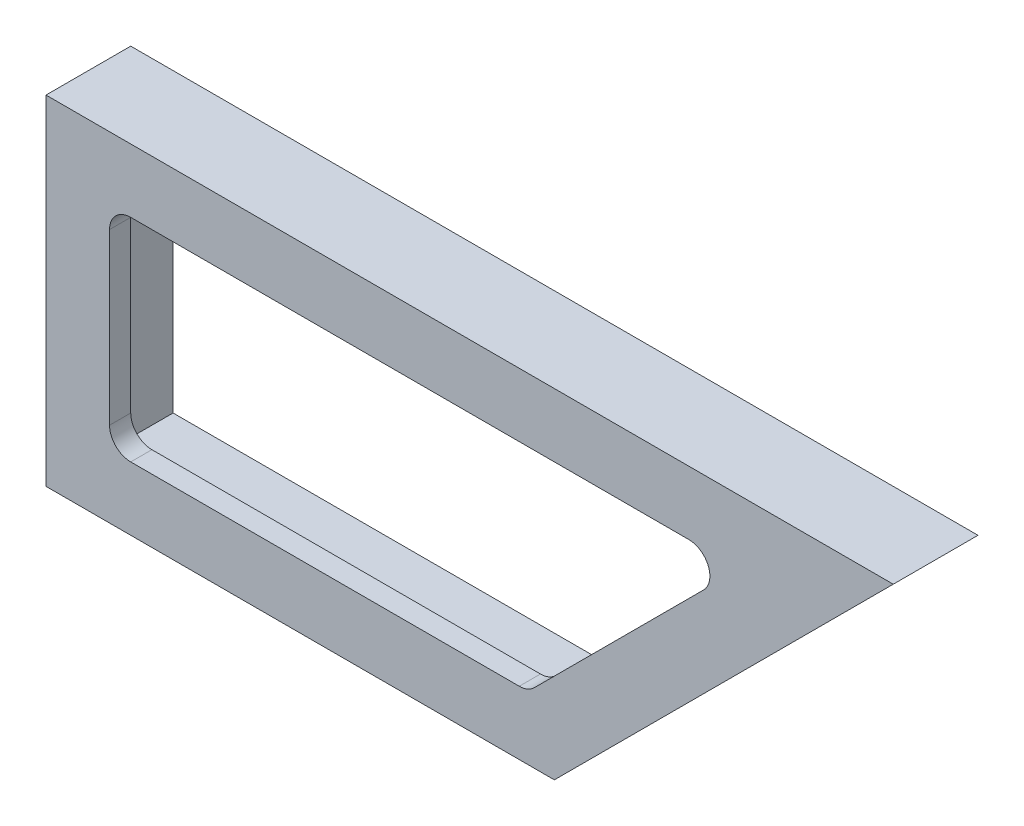
ISO-10303-21;
HEADER;
FILE_DESCRIPTION(('STEP AP214'),'2;1');
FILE_NAME('part.step','',(''),(''),'','','');
FILE_SCHEMA(('AUTOMOTIVE_DESIGN { 1 0 10303 214 1 1 1 1 }'));
ENDSEC;
DATA;
#1=APPLICATION_CONTEXT('core data for automotive mechanical design processes');
#2=APPLICATION_PROTOCOL_DEFINITION('international standard','automotive_design',2000,#1);
#3=PRODUCT_CONTEXT('',#1,'mechanical');
#4=PRODUCT('Part','Part','',(#3));
#5=PRODUCT_RELATED_PRODUCT_CATEGORY('part','',(#4));
#6=PRODUCT_DEFINITION_FORMATION('','',#4);
#7=PRODUCT_DEFINITION_CONTEXT('part definition',#1,'design');
#8=PRODUCT_DEFINITION('design','',#6,#7);
#9=PRODUCT_DEFINITION_SHAPE('','',#8);
#10=(LENGTH_UNIT() NAMED_UNIT(*) SI_UNIT(.MILLI.,.METRE.));
#11=(NAMED_UNIT(*) PLANE_ANGLE_UNIT() SI_UNIT($,.RADIAN.));
#12=(NAMED_UNIT(*) SI_UNIT($,.STERADIAN.) SOLID_ANGLE_UNIT());
#13=UNCERTAINTY_MEASURE_WITH_UNIT(LENGTH_MEASURE(1.E-05),#10,'distance_accuracy_value','');
#14=(GEOMETRIC_REPRESENTATION_CONTEXT(3) GLOBAL_UNCERTAINTY_ASSIGNED_CONTEXT((#13)) GLOBAL_UNIT_ASSIGNED_CONTEXT((#10,
#11,#12)) REPRESENTATION_CONTEXT('',''));
#15=CARTESIAN_POINT('',(0.,0.,0.));
#16=DIRECTION('',(0.,0.,1.));
#17=DIRECTION('',(1.,0.,0.));
#18=AXIS2_PLACEMENT_3D('',#15,#16,#17);
#19=CARTESIAN_POINT('',(0.,0.,2.));
#20=DIRECTION('',(0.,1.,0.));
#21=DIRECTION('',(0.,0.,1.));
#22=AXIS2_PLACEMENT_3D('',#19,#20,#21);
#23=PLANE('',#22);
#24=DIRECTION('',(1.,0.,0.));
#25=VECTOR('',#24,1.);
#26=CARTESIAN_POINT('',(0.,0.,0.));
#27=LINE('',#26,#25);
#28=CARTESIAN_POINT('',(-12.,0.,0.));
#29=VERTEX_POINT('',#28);
#30=CARTESIAN_POINT('',(0.,0.,0.));
#31=VERTEX_POINT('',#30);
#32=EDGE_CURVE('E188',#29,#31,#27,.T.);
#33=ORIENTED_EDGE('',*,*,#32,.T.);
#34=DIRECTION('',(0.,0.,-1.));
#35=VECTOR('',#34,1.);
#36=CARTESIAN_POINT('',(0.,0.,2.));
#37=LINE('',#36,#35);
#38=CARTESIAN_POINT('',(0.,0.,2.));
#39=VERTEX_POINT('',#38);
#40=EDGE_CURVE('E219',#39,#31,#37,.T.);
#41=ORIENTED_EDGE('',*,*,#40,.F.);
#42=DIRECTION('',(1.,0.,0.));
#43=VECTOR('',#42,1.);
#44=CARTESIAN_POINT('',(0.,0.,2.));
#45=LINE('',#44,#43);
#46=CARTESIAN_POINT('',(-12.,0.,2.));
#47=VERTEX_POINT('',#46);
#48=EDGE_CURVE('E192',#47,#39,#45,.T.);
#49=ORIENTED_EDGE('',*,*,#48,.F.);
#50=DIRECTION('',(0.,0.,-1.));
#51=VECTOR('',#50,1.);
#52=CARTESIAN_POINT('',(-12.,0.,2.));
#53=LINE('',#52,#51);
#54=EDGE_CURVE('E202',#47,#29,#53,.T.);
#55=ORIENTED_EDGE('',*,*,#54,.T.);
#56=EDGE_LOOP('',(#33,#41,#49,#55));
#57=FACE_BOUND('',#56,.T.);
#58=ADVANCED_FACE('F33',(#57),#23,.F.);
#59=CARTESIAN_POINT('',(0.,0.,2.));
#60=DIRECTION('',(-0.707106781186548,0.707106781186547,0.));
#61=DIRECTION('',(-0.707106781186547,-0.707106781186548,0.));
#62=AXIS2_PLACEMENT_3D('',#59,#60,#61);
#63=PLANE('',#62);
#64=DIRECTION('',(0.707106781186547,0.707106781186548,0.));
#65=VECTOR('',#64,1.);
#66=CARTESIAN_POINT('',(0.,0.,0.));
#67=LINE('',#66,#65);
#68=CARTESIAN_POINT('',(8.,8.,0.));
#69=VERTEX_POINT('',#68);
#70=EDGE_CURVE('E205',#31,#69,#67,.T.);
#71=ORIENTED_EDGE('',*,*,#70,.T.);
#72=DIRECTION('',(0.,0.,-1.));
#73=VECTOR('',#72,1.);
#74=CARTESIAN_POINT('',(8.,8.,2.));
#75=LINE('',#74,#73);
#76=CARTESIAN_POINT('',(8.,8.,2.));
#77=VERTEX_POINT('',#76);
#78=EDGE_CURVE('E216',#77,#69,#75,.T.);
#79=ORIENTED_EDGE('',*,*,#78,.F.);
#80=DIRECTION('',(0.707106781186547,0.707106781186548,0.));
#81=VECTOR('',#80,1.);
#82=CARTESIAN_POINT('',(0.,0.,2.));
#83=LINE('',#82,#81);
#84=EDGE_CURVE('E195',#39,#77,#83,.T.);
#85=ORIENTED_EDGE('',*,*,#84,.F.);
#86=ORIENTED_EDGE('',*,*,#40,.T.);
#87=EDGE_LOOP('',(#71,#79,#85,#86));
#88=FACE_BOUND('',#87,.T.);
#89=ADVANCED_FACE('F314',(#88),#63,.F.);
#90=CARTESIAN_POINT('',(0.,8.,2.));
#91=DIRECTION('',(0.,-1.,0.));
#92=DIRECTION('',(1.,0.,0.));
#93=AXIS2_PLACEMENT_3D('',#90,#91,#92);
#94=PLANE('',#93);
#95=DIRECTION('',(-1.,0.,0.));
#96=VECTOR('',#95,1.);
#97=CARTESIAN_POINT('',(0.,8.,0.));
#98=LINE('',#97,#96);
#99=CARTESIAN_POINT('',(-12.,8.,0.));
#100=VERTEX_POINT('',#99);
#101=EDGE_CURVE('E208',#69,#100,#98,.T.);
#102=ORIENTED_EDGE('',*,*,#101,.T.);
#103=DIRECTION('',(0.,0.,-1.));
#104=VECTOR('',#103,1.);
#105=CARTESIAN_POINT('',(-12.,8.,2.));
#106=LINE('',#105,#104);
#107=CARTESIAN_POINT('',(-12.,8.,2.));
#108=VERTEX_POINT('',#107);
#109=EDGE_CURVE('E213',#108,#100,#106,.T.);
#110=ORIENTED_EDGE('',*,*,#109,.F.);
#111=DIRECTION('',(-1.,0.,0.));
#112=VECTOR('',#111,1.);
#113=CARTESIAN_POINT('',(8.,8.,2.));
#114=LINE('',#113,#112);
#115=EDGE_CURVE('E198',#77,#108,#114,.T.);
#116=ORIENTED_EDGE('',*,*,#115,.F.);
#117=ORIENTED_EDGE('',*,*,#78,.T.);
#118=EDGE_LOOP('',(#102,#110,#116,#117));
#119=FACE_BOUND('',#118,.T.);
#120=ADVANCED_FACE('F319',(#119),#94,.F.);
#121=CARTESIAN_POINT('',(-12.,0.,2.));
#122=DIRECTION('',(1.,0.,0.));
#123=DIRECTION('',(0.,0.,-1.));
#124=AXIS2_PLACEMENT_3D('',#121,#122,#123);
#125=PLANE('',#124);
#126=DIRECTION('',(0.,-1.,0.));
#127=VECTOR('',#126,1.);
#128=CARTESIAN_POINT('',(-12.,0.,0.));
#129=LINE('',#128,#127);
#130=EDGE_CURVE('E196',#100,#29,#129,.T.);
#131=ORIENTED_EDGE('',*,*,#130,.T.);
#132=ORIENTED_EDGE('',*,*,#54,.F.);
#133=DIRECTION('',(0.,-1.,0.));
#134=VECTOR('',#133,1.);
#135=CARTESIAN_POINT('',(-12.,0.,2.));
#136=LINE('',#135,#134);
#137=EDGE_CURVE('E200',#108,#47,#136,.T.);
#138=ORIENTED_EDGE('',*,*,#137,.F.);
#139=ORIENTED_EDGE('',*,*,#109,.T.);
#140=EDGE_LOOP('',(#131,#132,#138,#139));
#141=FACE_BOUND('',#140,.T.);
#142=ADVANCED_FACE('F325',(#141),#125,.F.);
#143=CARTESIAN_POINT('',(0.,0.,2.));
#144=DIRECTION('',(0.,0.,-1.));
#145=DIRECTION('',(-1.,0.,0.));
#146=AXIS2_PLACEMENT_3D('',#143,#144,#145);
#147=PLANE('',#146);
#148=DIRECTION('',(1.,0.,0.));
#149=VECTOR('',#148,1.);
#150=CARTESIAN_POINT('',(-10.5,1.5,2.));
#151=LINE('',#150,#149);
#152=CARTESIAN_POINT('',(-10.,1.5,2.));
#153=VERTEX_POINT('',#152);
#154=CARTESIAN_POINT('',(-0.828427124746189,1.5,2.));
#155=VERTEX_POINT('',#154);
#156=EDGE_CURVE('E287',#153,#155,#151,.T.);
#157=ORIENTED_EDGE('',*,*,#156,.F.);
#158=CARTESIAN_POINT('',(-10.,2.,2.));
#159=DIRECTION('',(0.,0.,-1.));
#160=DIRECTION('',(-1.,0.,0.));
#161=AXIS2_PLACEMENT_3D('',#158,#159,#160);
#162=CIRCLE('',#161,0.5);
#163=CARTESIAN_POINT('',(-10.5,2.,2.));
#164=VERTEX_POINT('',#163);
#165=EDGE_CURVE('E259',#153,#164,#162,.T.);
#166=ORIENTED_EDGE('',*,*,#165,.T.);
#167=DIRECTION('',(0.,-1.,0.));
#168=VECTOR('',#167,1.);
#169=CARTESIAN_POINT('',(-10.5,6.5,2.));
#170=LINE('',#169,#168);
#171=CARTESIAN_POINT('',(-10.5,6.,2.));
#172=VERTEX_POINT('',#171);
#173=EDGE_CURVE('E269',#172,#164,#170,.T.);
#174=ORIENTED_EDGE('',*,*,#173,.F.);
#175=CARTESIAN_POINT('',(-10.,6.,2.));
#176=DIRECTION('',(0.,0.,-1.));
#177=DIRECTION('',(-1.,0.,0.));
#178=AXIS2_PLACEMENT_3D('',#175,#176,#177);
#179=CIRCLE('',#178,0.5);
#180=CARTESIAN_POINT('',(-10.,6.5,2.));
#181=VERTEX_POINT('',#180);
#182=EDGE_CURVE('E41',#172,#181,#179,.T.);
#183=ORIENTED_EDGE('',*,*,#182,.T.);
#184=DIRECTION('',(-1.,0.,0.));
#185=VECTOR('',#184,1.);
#186=CARTESIAN_POINT('',(-10.5,6.5,2.));
#187=LINE('',#186,#185);
#188=CARTESIAN_POINT('',(3.17157287525381,6.5,2.));
#189=VERTEX_POINT('',#188);
#190=EDGE_CURVE('E176',#189,#181,#187,.T.);
#191=ORIENTED_EDGE('',*,*,#190,.F.);
#192=CARTESIAN_POINT('',(3.17157287525381,6.,2.));
#193=DIRECTION('',(0.,0.,-1.));
#194=DIRECTION('',(-1.,0.,0.));
#195=AXIS2_PLACEMENT_3D('',#192,#193,#194);
#196=CIRCLE('',#195,0.5);
#197=CARTESIAN_POINT('',(3.52512626584709,5.64644660940673,2.));
#198=VERTEX_POINT('',#197);
#199=EDGE_CURVE('E255',#189,#198,#196,.T.);
#200=ORIENTED_EDGE('',*,*,#199,.T.);
#201=DIRECTION('',(0.707106781186547,0.707106781186547,0.));
#202=VECTOR('',#201,1.);
#203=CARTESIAN_POINT('',(4.37867965644036,6.5,2.));
#204=LINE('',#203,#202);
#205=CARTESIAN_POINT('',(-0.474873734152914,1.64644660940673,2.));
#206=VERTEX_POINT('',#205);
#207=EDGE_CURVE('E277',#206,#198,#204,.T.);
#208=ORIENTED_EDGE('',*,*,#207,.F.);
#209=CARTESIAN_POINT('',(-0.828427124746189,2.,2.));
#210=DIRECTION('',(0.,0.,-1.));
#211=DIRECTION('',(-1.,0.,0.));
#212=AXIS2_PLACEMENT_3D('',#209,#210,#211);
#213=CIRCLE('',#212,0.5);
#214=EDGE_CURVE('E251',#206,#155,#213,.T.);
#215=ORIENTED_EDGE('',*,*,#214,.T.);
#216=EDGE_LOOP('',(#157,#166,#174,#183,#191,#200,#208,#215));
#217=FACE_BOUND('',#216,.T.);
#218=ORIENTED_EDGE('',*,*,#48,.T.);
#219=ORIENTED_EDGE('',*,*,#84,.T.);
#220=ORIENTED_EDGE('',*,*,#115,.T.);
#221=ORIENTED_EDGE('',*,*,#137,.T.);
#222=EDGE_LOOP('',(#218,#219,#220,#221));
#223=FACE_BOUND('',#222,.T.);
#224=ADVANCED_FACE('F267',(#217,#223),#147,.F.);
#225=CARTESIAN_POINT('',(0.,0.,0.));
#226=DIRECTION('',(0.,0.,-1.));
#227=DIRECTION('',(-1.,0.,0.));
#228=AXIS2_PLACEMENT_3D('',#225,#226,#227);
#229=PLANE('',#228);
#230=DIRECTION('',(0.,1.,0.));
#231=VECTOR('',#230,1.);
#232=CARTESIAN_POINT('',(-11.,7.,0.));
#233=LINE('',#232,#231);
#234=CARTESIAN_POINT('',(-11.,1.,0.));
#235=VERTEX_POINT('',#234);
#236=CARTESIAN_POINT('',(-11.,7.,0.));
#237=VERTEX_POINT('',#236);
#238=EDGE_CURVE('E153',#235,#237,#233,.T.);
#239=ORIENTED_EDGE('',*,*,#238,.F.);
#240=DIRECTION('',(-1.,0.,0.));
#241=VECTOR('',#240,1.);
#242=CARTESIAN_POINT('',(-11.,1.,0.));
#243=LINE('',#242,#241);
#244=CARTESIAN_POINT('',(-0.414213562373093,1.,0.));
#245=VERTEX_POINT('',#244);
#246=EDGE_CURVE('E170',#245,#235,#243,.T.);
#247=ORIENTED_EDGE('',*,*,#246,.F.);
#248=DIRECTION('',(-0.707106781186548,-0.707106781186548,0.));
#249=VECTOR('',#248,1.);
#250=CARTESIAN_POINT('',(5.58578643762691,7.,0.));
#251=LINE('',#250,#249);
#252=CARTESIAN_POINT('',(5.58578643762691,7.,0.));
#253=VERTEX_POINT('',#252);
#254=EDGE_CURVE('E173',#253,#245,#251,.T.);
#255=ORIENTED_EDGE('',*,*,#254,.F.);
#256=DIRECTION('',(1.,0.,0.));
#257=VECTOR('',#256,1.);
#258=CARTESIAN_POINT('',(-0.414213562373093,7.,0.));
#259=LINE('',#258,#257);
#260=EDGE_CURVE('E182',#237,#253,#259,.T.);
#261=ORIENTED_EDGE('',*,*,#260,.F.);
#262=EDGE_LOOP('',(#239,#247,#255,#261));
#263=FACE_BOUND('',#262,.T.);
#264=ORIENTED_EDGE('',*,*,#32,.F.);
#265=ORIENTED_EDGE('',*,*,#130,.F.);
#266=ORIENTED_EDGE('',*,*,#101,.F.);
#267=ORIENTED_EDGE('',*,*,#70,.F.);
#268=EDGE_LOOP('',(#264,#265,#266,#267));
#269=FACE_BOUND('',#268,.T.);
#270=ADVANCED_FACE('F330',(#263,#269),#229,.T.);
#271=CARTESIAN_POINT('',(-11.,7.,1.5));
#272=DIRECTION('',(-1.,0.,0.));
#273=DIRECTION('',(0.,-1.,0.));
#274=AXIS2_PLACEMENT_3D('',#271,#272,#273);
#275=PLANE('',#274);
#276=ORIENTED_EDGE('',*,*,#238,.T.);
#277=DIRECTION('',(0.,0.,-1.));
#278=VECTOR('',#277,1.);
#279=CARTESIAN_POINT('',(-11.,7.,1.5));
#280=LINE('',#279,#278);
#281=CARTESIAN_POINT('',(-11.,7.,1.5));
#282=VERTEX_POINT('',#281);
#283=EDGE_CURVE('E146',#282,#237,#280,.T.);
#284=ORIENTED_EDGE('',*,*,#283,.F.);
#285=DIRECTION('',(0.,1.,0.));
#286=VECTOR('',#285,1.);
#287=CARTESIAN_POINT('',(-11.,7.,1.5));
#288=LINE('',#287,#286);
#289=CARTESIAN_POINT('',(-11.,1.,1.5));
#290=VERTEX_POINT('',#289);
#291=EDGE_CURVE('E150',#290,#282,#288,.T.);
#292=ORIENTED_EDGE('',*,*,#291,.F.);
#293=DIRECTION('',(0.,0.,-1.));
#294=VECTOR('',#293,1.);
#295=CARTESIAN_POINT('',(-11.,1.,1.5));
#296=LINE('',#295,#294);
#297=EDGE_CURVE('E186',#290,#235,#296,.T.);
#298=ORIENTED_EDGE('',*,*,#297,.T.);
#299=EDGE_LOOP('',(#276,#284,#292,#298));
#300=FACE_BOUND('',#299,.T.);
#301=ADVANCED_FACE('F148',(#300),#275,.F.);
#302=CARTESIAN_POINT('',(-11.,1.,1.5));
#303=DIRECTION('',(0.,-1.,0.));
#304=DIRECTION('',(1.,0.,0.));
#305=AXIS2_PLACEMENT_3D('',#302,#303,#304);
#306=PLANE('',#305);
#307=ORIENTED_EDGE('',*,*,#246,.T.);
#308=ORIENTED_EDGE('',*,*,#297,.F.);
#309=DIRECTION('',(-1.,0.,0.));
#310=VECTOR('',#309,1.);
#311=CARTESIAN_POINT('',(-11.,1.,1.5));
#312=LINE('',#311,#310);
#313=CARTESIAN_POINT('',(-0.414213562373093,1.,1.5));
#314=VERTEX_POINT('',#313);
#315=EDGE_CURVE('E158',#314,#290,#312,.T.);
#316=ORIENTED_EDGE('',*,*,#315,.F.);
#317=DIRECTION('',(0.,0.,-1.));
#318=VECTOR('',#317,1.);
#319=CARTESIAN_POINT('',(-0.414213562373093,1.,1.5));
#320=LINE('',#319,#318);
#321=EDGE_CURVE('E189',#314,#245,#320,.T.);
#322=ORIENTED_EDGE('',*,*,#321,.T.);
#323=EDGE_LOOP('',(#307,#308,#316,#322));
#324=FACE_BOUND('',#323,.T.);
#325=ADVANCED_FACE('F338',(#324),#306,.F.);
#326=CARTESIAN_POINT('',(5.58578643762691,7.,1.5));
#327=DIRECTION('',(0.707106781186547,-0.707106781186547,0.));
#328=DIRECTION('',(0.707106781186548,0.707106781186548,0.));
#329=AXIS2_PLACEMENT_3D('',#326,#327,#328);
#330=PLANE('',#329);
#331=ORIENTED_EDGE('',*,*,#254,.T.);
#332=ORIENTED_EDGE('',*,*,#321,.F.);
#333=DIRECTION('',(-0.707106781186548,-0.707106781186548,0.));
#334=VECTOR('',#333,1.);
#335=CARTESIAN_POINT('',(5.58578643762691,7.,1.5));
#336=LINE('',#335,#334);
#337=CARTESIAN_POINT('',(5.58578643762691,7.,1.5));
#338=VERTEX_POINT('',#337);
#339=EDGE_CURVE('E166',#338,#314,#336,.T.);
#340=ORIENTED_EDGE('',*,*,#339,.F.);
#341=DIRECTION('',(0.,0.,-1.));
#342=VECTOR('',#341,1.);
#343=CARTESIAN_POINT('',(5.58578643762691,7.,1.5));
#344=LINE('',#343,#342);
#345=EDGE_CURVE('E157',#338,#253,#344,.T.);
#346=ORIENTED_EDGE('',*,*,#345,.T.);
#347=EDGE_LOOP('',(#331,#332,#340,#346));
#348=FACE_BOUND('',#347,.T.);
#349=ADVANCED_FACE('F341',(#348),#330,.F.);
#350=CARTESIAN_POINT('',(-0.414213562373093,7.,1.5));
#351=DIRECTION('',(0.,1.,0.));
#352=DIRECTION('',(0.,0.,1.));
#353=AXIS2_PLACEMENT_3D('',#350,#351,#352);
#354=PLANE('',#353);
#355=ORIENTED_EDGE('',*,*,#260,.T.);
#356=ORIENTED_EDGE('',*,*,#345,.F.);
#357=DIRECTION('',(1.,0.,0.));
#358=VECTOR('',#357,1.);
#359=CARTESIAN_POINT('',(-11.,7.,1.5));
#360=LINE('',#359,#358);
#361=EDGE_CURVE('E161',#282,#338,#360,.T.);
#362=ORIENTED_EDGE('',*,*,#361,.F.);
#363=ORIENTED_EDGE('',*,*,#283,.T.);
#364=EDGE_LOOP('',(#355,#356,#362,#363));
#365=FACE_BOUND('',#364,.T.);
#366=ADVANCED_FACE('F162',(#365),#354,.F.);
#367=CARTESIAN_POINT('',(0.,0.,1.5));
#368=DIRECTION('',(0.,0.,1.));
#369=DIRECTION('',(1.,0.,0.));
#370=AXIS2_PLACEMENT_3D('',#367,#368,#369);
#371=PLANE('',#370);
#372=DIRECTION('',(0.707106781186548,0.707106781186548,0.));
#373=VECTOR('',#372,1.);
#374=CARTESIAN_POINT('',(-1.06066017177982,1.06066017177982,1.5));
#375=LINE('',#374,#373);
#376=CARTESIAN_POINT('',(-0.474873734152915,1.64644660940673,1.5));
#377=VERTEX_POINT('',#376);
#378=CARTESIAN_POINT('',(3.52512626584709,5.64644660940673,1.5));
#379=VERTEX_POINT('',#378);
#380=EDGE_CURVE('E225',#377,#379,#375,.T.);
#381=ORIENTED_EDGE('',*,*,#380,.T.);
#382=CARTESIAN_POINT('',(3.17157287525381,6.,1.5));
#383=DIRECTION('',(0.,0.,1.));
#384=DIRECTION('',(1.,0.,0.));
#385=AXIS2_PLACEMENT_3D('',#382,#383,#384);
#386=CIRCLE('',#385,0.5);
#387=CARTESIAN_POINT('',(3.17157287525381,6.5,1.5));
#388=VERTEX_POINT('',#387);
#389=EDGE_CURVE('E257',#379,#388,#386,.T.);
#390=ORIENTED_EDGE('',*,*,#389,.T.);
#391=DIRECTION('',(-1.,0.,0.));
#392=VECTOR('',#391,1.);
#393=CARTESIAN_POINT('',(0.,6.5,1.5));
#394=LINE('',#393,#392);
#395=CARTESIAN_POINT('',(-10.,6.5,1.5));
#396=VERTEX_POINT('',#395);
#397=EDGE_CURVE('E228',#388,#396,#394,.T.);
#398=ORIENTED_EDGE('',*,*,#397,.T.);
#399=CARTESIAN_POINT('',(-10.,6.,1.5));
#400=DIRECTION('',(0.,0.,1.));
#401=DIRECTION('',(1.,0.,0.));
#402=AXIS2_PLACEMENT_3D('',#399,#400,#401);
#403=CIRCLE('',#402,0.5);
#404=CARTESIAN_POINT('',(-10.5,6.,1.5));
#405=VERTEX_POINT('',#404);
#406=EDGE_CURVE('E11',#396,#405,#403,.T.);
#407=ORIENTED_EDGE('',*,*,#406,.T.);
#408=DIRECTION('',(0.,-1.,0.));
#409=VECTOR('',#408,1.);
#410=CARTESIAN_POINT('',(-10.5,0.,1.5));
#411=LINE('',#410,#409);
#412=CARTESIAN_POINT('',(-10.5,2.,1.5));
#413=VERTEX_POINT('',#412);
#414=EDGE_CURVE('E230',#405,#413,#411,.T.);
#415=ORIENTED_EDGE('',*,*,#414,.T.);
#416=CARTESIAN_POINT('',(-10.,2.,1.5));
#417=DIRECTION('',(0.,0.,1.));
#418=DIRECTION('',(1.,0.,0.));
#419=AXIS2_PLACEMENT_3D('',#416,#417,#418);
#420=CIRCLE('',#419,0.5);
#421=CARTESIAN_POINT('',(-10.,1.5,1.5));
#422=VERTEX_POINT('',#421);
#423=EDGE_CURVE('E261',#413,#422,#420,.T.);
#424=ORIENTED_EDGE('',*,*,#423,.T.);
#425=DIRECTION('',(1.,0.,0.));
#426=VECTOR('',#425,1.);
#427=CARTESIAN_POINT('',(0.,1.5,1.5));
#428=LINE('',#427,#426);
#429=CARTESIAN_POINT('',(-0.828427124746189,1.5,1.5));
#430=VERTEX_POINT('',#429);
#431=EDGE_CURVE('E222',#422,#430,#428,.T.);
#432=ORIENTED_EDGE('',*,*,#431,.T.);
#433=CARTESIAN_POINT('',(-0.828427124746189,2.,1.5));
#434=DIRECTION('',(0.,0.,1.));
#435=DIRECTION('',(1.,0.,0.));
#436=AXIS2_PLACEMENT_3D('',#433,#434,#435);
#437=CIRCLE('',#436,0.5);
#438=EDGE_CURVE('E253',#430,#377,#437,.T.);
#439=ORIENTED_EDGE('',*,*,#438,.T.);
#440=EDGE_LOOP('',(#381,#390,#398,#407,#415,#424,#432,#439));
#441=FACE_BOUND('',#440,.T.);
#442=ORIENTED_EDGE('',*,*,#291,.T.);
#443=ORIENTED_EDGE('',*,*,#361,.T.);
#444=ORIENTED_EDGE('',*,*,#339,.T.);
#445=ORIENTED_EDGE('',*,*,#315,.T.);
#446=EDGE_LOOP('',(#442,#443,#444,#445));
#447=FACE_BOUND('',#446,.T.);
#448=ADVANCED_FACE('F168',(#441,#447),#371,.F.);
#449=CARTESIAN_POINT('',(-10.5,6.5,0.));
#450=DIRECTION('',(-1.,0.,0.));
#451=DIRECTION('',(0.,-1.,0.));
#452=AXIS2_PLACEMENT_3D('',#449,#450,#451);
#453=PLANE('',#452);
#454=ORIENTED_EDGE('',*,*,#173,.T.);
#455=DIRECTION('',(0.,0.,1.));
#456=VECTOR('',#455,1.);
#457=CARTESIAN_POINT('',(-10.5,2.,1.5));
#458=LINE('',#457,#456);
#459=EDGE_CURVE('E48',#164,#413,#458,.F.);
#460=ORIENTED_EDGE('',*,*,#459,.T.);
#461=ORIENTED_EDGE('',*,*,#414,.F.);
#462=DIRECTION('',(0.,0.,1.));
#463=VECTOR('',#462,1.);
#464=CARTESIAN_POINT('',(-10.5,6.,2.));
#465=LINE('',#464,#463);
#466=EDGE_CURVE('E247',#405,#172,#465,.T.);
#467=ORIENTED_EDGE('',*,*,#466,.T.);
#468=EDGE_LOOP('',(#454,#460,#461,#467));
#469=FACE_BOUND('',#468,.T.);
#470=ADVANCED_FACE('F278',(#469),#453,.F.);
#471=CARTESIAN_POINT('',(-10.5,6.5,0.));
#472=DIRECTION('',(0.,1.,0.));
#473=DIRECTION('',(0.,0.,1.));
#474=AXIS2_PLACEMENT_3D('',#471,#472,#473);
#475=PLANE('',#474);
#476=ORIENTED_EDGE('',*,*,#397,.F.);
#477=DIRECTION('',(0.,0.,1.));
#478=VECTOR('',#477,1.);
#479=CARTESIAN_POINT('',(3.17157287525381,6.5,2.));
#480=LINE('',#479,#478);
#481=EDGE_CURVE('E244',#388,#189,#480,.T.);
#482=ORIENTED_EDGE('',*,*,#481,.T.);
#483=ORIENTED_EDGE('',*,*,#190,.T.);
#484=DIRECTION('',(0.,0.,1.));
#485=VECTOR('',#484,1.);
#486=CARTESIAN_POINT('',(-10.,6.5,1.5));
#487=LINE('',#486,#485);
#488=EDGE_CURVE('E242',#181,#396,#487,.F.);
#489=ORIENTED_EDGE('',*,*,#488,.T.);
#490=EDGE_LOOP('',(#476,#482,#483,#489));
#491=FACE_BOUND('',#490,.T.);
#492=ADVANCED_FACE('F275',(#491),#475,.F.);
#493=CARTESIAN_POINT('',(4.37867965644036,6.5,0.));
#494=DIRECTION('',(0.707106781186547,-0.707106781186547,0.));
#495=DIRECTION('',(0.707106781186548,0.707106781186548,0.));
#496=AXIS2_PLACEMENT_3D('',#493,#494,#495);
#497=PLANE('',#496);
#498=ORIENTED_EDGE('',*,*,#380,.F.);
#499=DIRECTION('',(0.,0.,1.));
#500=VECTOR('',#499,1.);
#501=CARTESIAN_POINT('',(-0.474873734152916,1.64644660940673,2.));
#502=LINE('',#501,#500);
#503=EDGE_CURVE('E234',#377,#206,#502,.T.);
#504=ORIENTED_EDGE('',*,*,#503,.T.);
#505=ORIENTED_EDGE('',*,*,#207,.T.);
#506=DIRECTION('',(0.,0.,1.));
#507=VECTOR('',#506,1.);
#508=CARTESIAN_POINT('',(3.52512626584709,5.64644660940673,1.5));
#509=LINE('',#508,#507);
#510=EDGE_CURVE('E232',#198,#379,#509,.F.);
#511=ORIENTED_EDGE('',*,*,#510,.T.);
#512=EDGE_LOOP('',(#498,#504,#505,#511));
#513=FACE_BOUND('',#512,.T.);
#514=ADVANCED_FACE('F296',(#513),#497,.F.);
#515=CARTESIAN_POINT('',(-10.5,1.5,0.));
#516=DIRECTION('',(0.,-1.,0.));
#517=DIRECTION('',(0.,0.,-1.));
#518=AXIS2_PLACEMENT_3D('',#515,#516,#517);
#519=PLANE('',#518);
#520=ORIENTED_EDGE('',*,*,#156,.T.);
#521=DIRECTION('',(0.,0.,1.));
#522=VECTOR('',#521,1.);
#523=CARTESIAN_POINT('',(-0.828427124746189,1.5,1.5));
#524=LINE('',#523,#522);
#525=EDGE_CURVE('E240',#155,#430,#524,.F.);
#526=ORIENTED_EDGE('',*,*,#525,.T.);
#527=ORIENTED_EDGE('',*,*,#431,.F.);
#528=DIRECTION('',(0.,0.,1.));
#529=VECTOR('',#528,1.);
#530=CARTESIAN_POINT('',(-10.,1.5,2.));
#531=LINE('',#530,#529);
#532=EDGE_CURVE('E237',#422,#153,#531,.T.);
#533=ORIENTED_EDGE('',*,*,#532,.T.);
#534=EDGE_LOOP('',(#520,#526,#527,#533));
#535=FACE_BOUND('',#534,.T.);
#536=ADVANCED_FACE('F286',(#535),#519,.F.);
#537=CARTESIAN_POINT('',(-0.828427124746189,2.,0.));
#538=DIRECTION('',(0.,0.,-1.));
#539=DIRECTION('',(-1.,0.,0.));
#540=AXIS2_PLACEMENT_3D('',#537,#538,#539);
#541=CYLINDRICAL_SURFACE('',#540,0.5);
#542=ORIENTED_EDGE('',*,*,#438,.F.);
#543=ORIENTED_EDGE('',*,*,#525,.F.);
#544=ORIENTED_EDGE('',*,*,#214,.F.);
#545=ORIENTED_EDGE('',*,*,#503,.F.);
#546=EDGE_LOOP('',(#542,#543,#544,#545));
#547=FACE_BOUND('',#546,.T.);
#548=ADVANCED_FACE('F303',(#547),#541,.F.);
#549=CARTESIAN_POINT('',(3.17157287525381,6.,0.));
#550=DIRECTION('',(0.,0.,-1.));
#551=DIRECTION('',(-1.,0.,0.));
#552=AXIS2_PLACEMENT_3D('',#549,#550,#551);
#553=CYLINDRICAL_SURFACE('',#552,0.5);
#554=ORIENTED_EDGE('',*,*,#389,.F.);
#555=ORIENTED_EDGE('',*,*,#510,.F.);
#556=ORIENTED_EDGE('',*,*,#199,.F.);
#557=ORIENTED_EDGE('',*,*,#481,.F.);
#558=EDGE_LOOP('',(#554,#555,#556,#557));
#559=FACE_BOUND('',#558,.T.);
#560=ADVANCED_FACE('F300',(#559),#553,.F.);
#561=CARTESIAN_POINT('',(-10.,2.,0.));
#562=DIRECTION('',(0.,0.,-1.));
#563=DIRECTION('',(-1.,0.,0.));
#564=AXIS2_PLACEMENT_3D('',#561,#562,#563);
#565=CYLINDRICAL_SURFACE('',#564,0.5);
#566=ORIENTED_EDGE('',*,*,#423,.F.);
#567=ORIENTED_EDGE('',*,*,#459,.F.);
#568=ORIENTED_EDGE('',*,*,#165,.F.);
#569=ORIENTED_EDGE('',*,*,#532,.F.);
#570=EDGE_LOOP('',(#566,#567,#568,#569));
#571=FACE_BOUND('',#570,.T.);
#572=ADVANCED_FACE('F283',(#571),#565,.F.);
#573=CARTESIAN_POINT('',(-10.,6.,0.));
#574=DIRECTION('',(0.,0.,-1.));
#575=DIRECTION('',(-1.,0.,0.));
#576=AXIS2_PLACEMENT_3D('',#573,#574,#575);
#577=CYLINDRICAL_SURFACE('',#576,0.5);
#578=ORIENTED_EDGE('',*,*,#406,.F.);
#579=ORIENTED_EDGE('',*,*,#488,.F.);
#580=ORIENTED_EDGE('',*,*,#182,.F.);
#581=ORIENTED_EDGE('',*,*,#466,.F.);
#582=EDGE_LOOP('',(#578,#579,#580,#581));
#583=FACE_BOUND('',#582,.T.);
#584=ADVANCED_FACE('F35',(#583),#577,.F.);
#585=CLOSED_SHELL('',(#58,#89,#120,#142,#224,#270,#301,#325,#349,#366,#448,#470,#492,#514,#536,
#548,#560,#572,#584));
#586=MANIFOLD_SOLID_BREP('B2',#585);
#587=ADVANCED_BREP_SHAPE_REPRESENTATION('',(#18,#586),#14);
#588=SHAPE_DEFINITION_REPRESENTATION(#9,#587);
ENDSEC;
END-ISO-10303-21;
